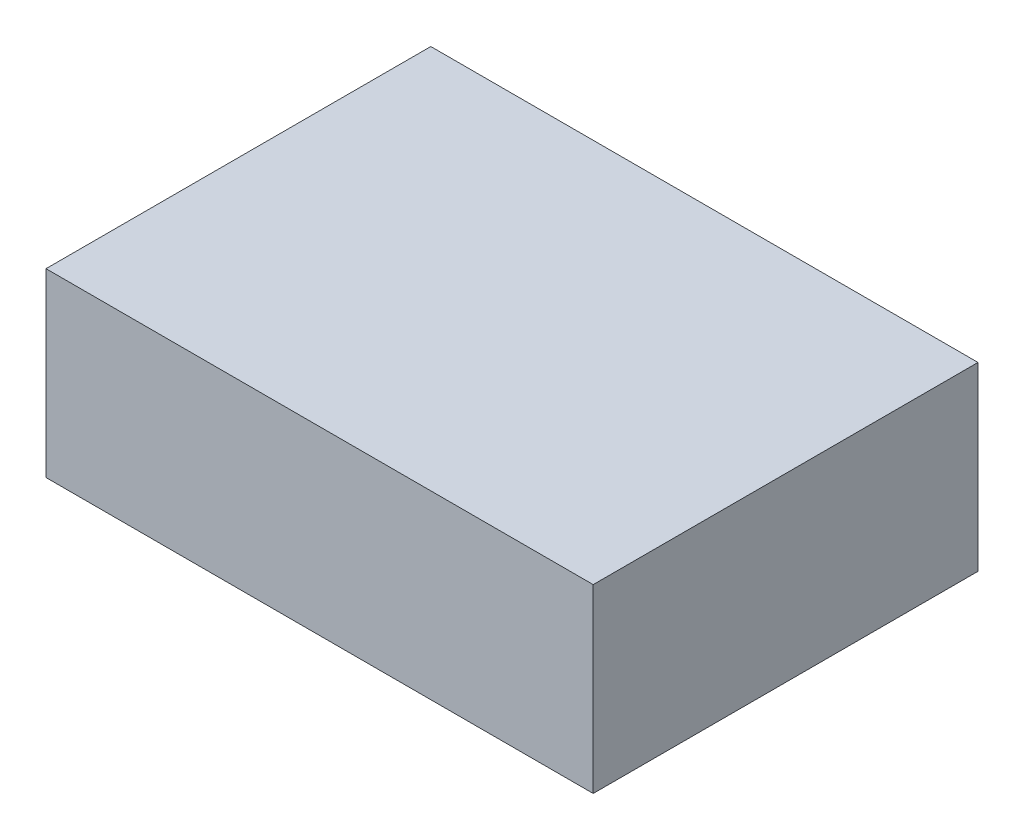
ISO-10303-21;
HEADER;
FILE_DESCRIPTION(('STEP AP214'),'2;1');
FILE_NAME('part.step','',(''),(''),'','','');
FILE_SCHEMA(('AUTOMOTIVE_DESIGN { 1 0 10303 214 1 1 1 1 }'));
ENDSEC;
DATA;
#1=APPLICATION_CONTEXT('core data for automotive mechanical design processes');
#2=APPLICATION_PROTOCOL_DEFINITION('international standard','automotive_design',2000,#1);
#3=PRODUCT_CONTEXT('',#1,'mechanical');
#4=PRODUCT('Part','Part','',(#3));
#5=PRODUCT_RELATED_PRODUCT_CATEGORY('part','',(#4));
#6=PRODUCT_DEFINITION_FORMATION('','',#4);
#7=PRODUCT_DEFINITION_CONTEXT('part definition',#1,'design');
#8=PRODUCT_DEFINITION('design','',#6,#7);
#9=PRODUCT_DEFINITION_SHAPE('','',#8);
#10=(LENGTH_UNIT() NAMED_UNIT(*) SI_UNIT(.MILLI.,.METRE.));
#11=(NAMED_UNIT(*) PLANE_ANGLE_UNIT() SI_UNIT($,.RADIAN.));
#12=(NAMED_UNIT(*) SI_UNIT($,.STERADIAN.) SOLID_ANGLE_UNIT());
#13=UNCERTAINTY_MEASURE_WITH_UNIT(LENGTH_MEASURE(1.E-05),#10,'distance_accuracy_value','');
#14=(GEOMETRIC_REPRESENTATION_CONTEXT(3) GLOBAL_UNCERTAINTY_ASSIGNED_CONTEXT((#13)) GLOBAL_UNIT_ASSIGNED_CONTEXT((#10,
#11,#12)) REPRESENTATION_CONTEXT('',''));
#15=CARTESIAN_POINT('',(0.,0.,0.));
#16=DIRECTION('',(0.,0.,1.));
#17=DIRECTION('',(1.,0.,0.));
#18=AXIS2_PLACEMENT_3D('',#15,#16,#17);
#19=CARTESIAN_POINT('',(54.75,36.2,38.5));
#20=DIRECTION('',(-1.,0.,0.));
#21=DIRECTION('',(0.,0.,1.));
#22=AXIS2_PLACEMENT_3D('',#19,#20,#21);
#23=PLANE('',#22);
#24=DIRECTION('',(0.,0.,-1.));
#25=VECTOR('',#24,1.);
#26=CARTESIAN_POINT('',(54.75,0.,38.5));
#27=LINE('',#26,#25);
#28=CARTESIAN_POINT('',(54.75,0.,38.5));
#29=VERTEX_POINT('',#28);
#30=CARTESIAN_POINT('',(54.75,0.,-38.5));
#31=VERTEX_POINT('',#30);
#32=EDGE_CURVE('E113',#29,#31,#27,.T.);
#33=ORIENTED_EDGE('',*,*,#32,.T.);
#34=DIRECTION('',(0.,-1.,0.));
#35=VECTOR('',#34,1.);
#36=CARTESIAN_POINT('',(54.75,36.2,-38.5));
#37=LINE('',#36,#35);
#38=CARTESIAN_POINT('',(54.75,36.2,-38.5));
#39=VERTEX_POINT('',#38);
#40=EDGE_CURVE('E11',#39,#31,#37,.T.);
#41=ORIENTED_EDGE('',*,*,#40,.F.);
#42=DIRECTION('',(0.,0.,-1.));
#43=VECTOR('',#42,1.);
#44=CARTESIAN_POINT('',(54.75,36.2,38.5));
#45=LINE('',#44,#43);
#46=CARTESIAN_POINT('',(54.75,36.2,38.5));
#47=VERTEX_POINT('',#46);
#48=EDGE_CURVE('E97',#47,#39,#45,.T.);
#49=ORIENTED_EDGE('',*,*,#48,.F.);
#50=DIRECTION('',(0.,-1.,0.));
#51=VECTOR('',#50,1.);
#52=CARTESIAN_POINT('',(54.75,36.2,38.5));
#53=LINE('',#52,#51);
#54=EDGE_CURVE('E109',#47,#29,#53,.T.);
#55=ORIENTED_EDGE('',*,*,#54,.T.);
#56=EDGE_LOOP('',(#33,#41,#49,#55));
#57=FACE_BOUND('',#56,.T.);
#58=ADVANCED_FACE('F45',(#57),#23,.F.);
#59=CARTESIAN_POINT('',(-54.75,36.2,-38.5));
#60=DIRECTION('',(0.,0.,1.));
#61=DIRECTION('',(1.,0.,0.));
#62=AXIS2_PLACEMENT_3D('',#59,#60,#61);
#63=PLANE('',#62);
#64=DIRECTION('',(-1.,0.,0.));
#65=VECTOR('',#64,1.);
#66=CARTESIAN_POINT('',(-54.75,0.,-38.5));
#67=LINE('',#66,#65);
#68=CARTESIAN_POINT('',(-54.75,0.,-38.5));
#69=VERTEX_POINT('',#68);
#70=EDGE_CURVE('E102',#31,#69,#67,.T.);
#71=ORIENTED_EDGE('',*,*,#70,.T.);
#72=DIRECTION('',(0.,-1.,0.));
#73=VECTOR('',#72,1.);
#74=CARTESIAN_POINT('',(-54.75,36.2,-38.5));
#75=LINE('',#74,#73);
#76=CARTESIAN_POINT('',(-54.75,36.2,-38.5));
#77=VERTEX_POINT('',#76);
#78=EDGE_CURVE('E54',#77,#69,#75,.T.);
#79=ORIENTED_EDGE('',*,*,#78,.F.);
#80=DIRECTION('',(-1.,0.,0.));
#81=VECTOR('',#80,1.);
#82=CARTESIAN_POINT('',(-54.75,36.2,-38.5));
#83=LINE('',#82,#81);
#84=EDGE_CURVE('E92',#39,#77,#83,.T.);
#85=ORIENTED_EDGE('',*,*,#84,.F.);
#86=ORIENTED_EDGE('',*,*,#40,.T.);
#87=EDGE_LOOP('',(#71,#79,#85,#86));
#88=FACE_BOUND('',#87,.T.);
#89=ADVANCED_FACE('F101',(#88),#63,.F.);
#90=CARTESIAN_POINT('',(-54.75,36.2,38.5));
#91=DIRECTION('',(1.,0.,0.));
#92=DIRECTION('',(0.,0.,-1.));
#93=AXIS2_PLACEMENT_3D('',#90,#91,#92);
#94=PLANE('',#93);
#95=DIRECTION('',(0.,0.,1.));
#96=VECTOR('',#95,1.);
#97=CARTESIAN_POINT('',(-54.75,0.,38.5));
#98=LINE('',#97,#96);
#99=CARTESIAN_POINT('',(-54.75,0.,38.5));
#100=VERTEX_POINT('',#99);
#101=EDGE_CURVE('E79',#69,#100,#98,.T.);
#102=ORIENTED_EDGE('',*,*,#101,.T.);
#103=DIRECTION('',(0.,-1.,0.));
#104=VECTOR('',#103,1.);
#105=CARTESIAN_POINT('',(-54.75,36.2,38.5));
#106=LINE('',#105,#104);
#107=CARTESIAN_POINT('',(-54.75,36.2,38.5));
#108=VERTEX_POINT('',#107);
#109=EDGE_CURVE('E104',#108,#100,#106,.T.);
#110=ORIENTED_EDGE('',*,*,#109,.F.);
#111=DIRECTION('',(0.,0.,1.));
#112=VECTOR('',#111,1.);
#113=CARTESIAN_POINT('',(-54.75,36.2,38.5));
#114=LINE('',#113,#112);
#115=EDGE_CURVE('E95',#77,#108,#114,.T.);
#116=ORIENTED_EDGE('',*,*,#115,.F.);
#117=ORIENTED_EDGE('',*,*,#78,.T.);
#118=EDGE_LOOP('',(#102,#110,#116,#117));
#119=FACE_BOUND('',#118,.T.);
#120=ADVANCED_FACE('F105',(#119),#94,.F.);
#121=CARTESIAN_POINT('',(-54.75,36.2,38.5));
#122=DIRECTION('',(0.,0.,-1.));
#123=DIRECTION('',(-1.,0.,0.));
#124=AXIS2_PLACEMENT_3D('',#121,#122,#123);
#125=PLANE('',#124);
#126=DIRECTION('',(1.,0.,0.));
#127=VECTOR('',#126,1.);
#128=CARTESIAN_POINT('',(-54.75,0.,38.5));
#129=LINE('',#128,#127);
#130=EDGE_CURVE('E85',#100,#29,#129,.T.);
#131=ORIENTED_EDGE('',*,*,#130,.T.);
#132=ORIENTED_EDGE('',*,*,#54,.F.);
#133=DIRECTION('',(1.,0.,0.));
#134=VECTOR('',#133,1.);
#135=CARTESIAN_POINT('',(-54.75,36.2,38.5));
#136=LINE('',#135,#134);
#137=EDGE_CURVE('E62',#108,#47,#136,.T.);
#138=ORIENTED_EDGE('',*,*,#137,.F.);
#139=ORIENTED_EDGE('',*,*,#109,.T.);
#140=EDGE_LOOP('',(#131,#132,#138,#139));
#141=FACE_BOUND('',#140,.T.);
#142=ADVANCED_FACE('F126',(#141),#125,.F.);
#143=CARTESIAN_POINT('',(0.,36.2,0.));
#144=DIRECTION('',(0.,-1.,0.));
#145=DIRECTION('',(0.,0.,-1.));
#146=AXIS2_PLACEMENT_3D('',#143,#144,#145);
#147=PLANE('',#146);
#148=ORIENTED_EDGE('',*,*,#48,.T.);
#149=ORIENTED_EDGE('',*,*,#84,.T.);
#150=ORIENTED_EDGE('',*,*,#115,.T.);
#151=ORIENTED_EDGE('',*,*,#137,.T.);
#152=EDGE_LOOP('',(#148,#149,#150,#151));
#153=FACE_BOUND('',#152,.T.);
#154=ADVANCED_FACE('F93',(#153),#147,.F.);
#155=CARTESIAN_POINT('',(0.,0.,0.));
#156=DIRECTION('',(0.,-1.,0.));
#157=DIRECTION('',(0.,0.,-1.));
#158=AXIS2_PLACEMENT_3D('',#155,#156,#157);
#159=PLANE('',#158);
#160=ORIENTED_EDGE('',*,*,#32,.F.);
#161=ORIENTED_EDGE('',*,*,#130,.F.);
#162=ORIENTED_EDGE('',*,*,#101,.F.);
#163=ORIENTED_EDGE('',*,*,#70,.F.);
#164=EDGE_LOOP('',(#160,#161,#162,#163));
#165=FACE_BOUND('',#164,.T.);
#166=ADVANCED_FACE('F129',(#165),#159,.T.);
#167=CLOSED_SHELL('',(#58,#89,#120,#142,#154,#166));
#168=MANIFOLD_SOLID_BREP('B2',#167);
#169=ADVANCED_BREP_SHAPE_REPRESENTATION('',(#18,#168),#14);
#170=SHAPE_DEFINITION_REPRESENTATION(#9,#169);
ENDSEC;
END-ISO-10303-21;
